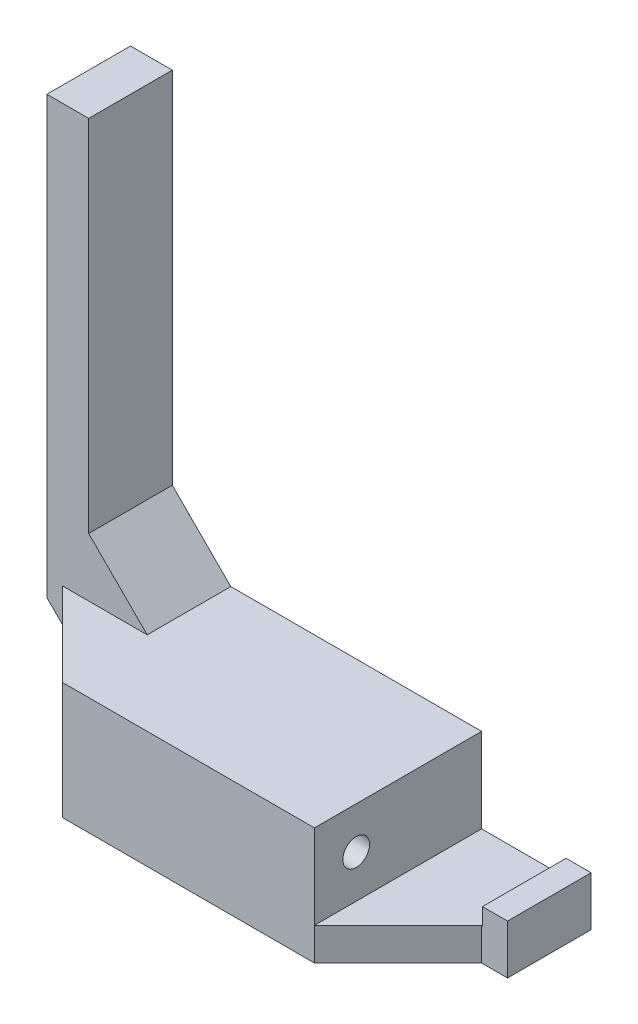
ISO-10303-21;
HEADER;
FILE_DESCRIPTION(('STEP AP214'),'2;1');
FILE_NAME('part.step','',(''),(''),'','','');
FILE_SCHEMA(('AUTOMOTIVE_DESIGN { 1 0 10303 214 1 1 1 1 }'));
ENDSEC;
DATA;
#1=APPLICATION_CONTEXT('core data for automotive mechanical design processes');
#2=APPLICATION_PROTOCOL_DEFINITION('international standard','automotive_design',2000,#1);
#3=PRODUCT_CONTEXT('',#1,'mechanical');
#4=PRODUCT('Part','Part','',(#3));
#5=PRODUCT_RELATED_PRODUCT_CATEGORY('part','',(#4));
#6=PRODUCT_DEFINITION_FORMATION('','',#4);
#7=PRODUCT_DEFINITION_CONTEXT('part definition',#1,'design');
#8=PRODUCT_DEFINITION('design','',#6,#7);
#9=PRODUCT_DEFINITION_SHAPE('','',#8);
#10=(LENGTH_UNIT() NAMED_UNIT(*) SI_UNIT(.MILLI.,.METRE.));
#11=(NAMED_UNIT(*) PLANE_ANGLE_UNIT() SI_UNIT($,.RADIAN.));
#12=(NAMED_UNIT(*) SI_UNIT($,.STERADIAN.) SOLID_ANGLE_UNIT());
#13=UNCERTAINTY_MEASURE_WITH_UNIT(LENGTH_MEASURE(1.E-05),#10,'distance_accuracy_value','');
#14=(GEOMETRIC_REPRESENTATION_CONTEXT(3) GLOBAL_UNCERTAINTY_ASSIGNED_CONTEXT((#13)) GLOBAL_UNIT_ASSIGNED_CONTEXT((#10,
#11,#12)) REPRESENTATION_CONTEXT('',''));
#15=CARTESIAN_POINT('',(0.,0.,0.));
#16=DIRECTION('',(0.,0.,1.));
#17=DIRECTION('',(1.,0.,0.));
#18=AXIS2_PLACEMENT_3D('',#15,#16,#17);
#19=CARTESIAN_POINT('',(-42.,5.1,15.));
#20=DIRECTION('',(1.,0.,0.));
#21=DIRECTION('',(0.,0.,-1.));
#22=AXIS2_PLACEMENT_3D('',#19,#20,#21);
#23=CYLINDRICAL_SURFACE('',#22,1.6);
#24=CARTESIAN_POINT('',(0.,5.1,15.));
#25=DIRECTION('',(1.,0.,0.));
#26=DIRECTION('',(0.,0.,-1.));
#27=AXIS2_PLACEMENT_3D('',#24,#25,#26);
#28=CIRCLE('',#27,1.6);
#29=CARTESIAN_POINT('',(0.,5.1,13.4));
#30=VERTEX_POINT('',#29);
#31=EDGE_CURVE('E181',#30,#30,#28,.T.);
#32=ORIENTED_EDGE('',*,*,#31,.T.);
#33=EDGE_LOOP('',(#32));
#34=FACE_BOUND('',#33,.T.);
#35=CARTESIAN_POINT('',(-19.,5.1,15.));
#36=DIRECTION('',(-1.,0.,0.));
#37=DIRECTION('',(0.,-1.,0.));
#38=AXIS2_PLACEMENT_3D('',#35,#36,#37);
#39=CIRCLE('',#38,1.6);
#40=CARTESIAN_POINT('',(-19.,3.49999999999999,15.));
#41=VERTEX_POINT('',#40);
#42=EDGE_CURVE('E277',#41,#41,#39,.F.);
#43=ORIENTED_EDGE('',*,*,#42,.F.);
#44=EDGE_LOOP('',(#43));
#45=FACE_BOUND('',#44,.T.);
#46=ADVANCED_FACE('F35',(#34,#45),#23,.F.);
#47=CARTESIAN_POINT('',(0.,0.,10.));
#48=DIRECTION('',(0.,0.,-1.));
#49=DIRECTION('',(-1.,0.,0.));
#50=AXIS2_PLACEMENT_3D('',#47,#48,#49);
#51=PLANE('',#50);
#52=DIRECTION('',(-1.,0.,0.));
#53=VECTOR('',#52,1.);
#54=CARTESIAN_POINT('',(10.1,0.,10.));
#55=LINE('',#54,#53);
#56=CARTESIAN_POINT('',(10.1,0.,10.));
#57=VERTEX_POINT('',#56);
#58=CARTESIAN_POINT('',(9.99999999999997,0.,10.));
#59=VERTEX_POINT('',#58);
#60=EDGE_CURVE('E198',#57,#59,#55,.T.);
#61=ORIENTED_EDGE('',*,*,#60,.T.);
#62=DIRECTION('',(0.,-1.,0.));
#63=VECTOR('',#62,1.);
#64=CARTESIAN_POINT('',(9.99999999999997,-3.9,10.));
#65=LINE('',#64,#63);
#66=CARTESIAN_POINT('',(9.99999999999997,-3.9,10.));
#67=VERTEX_POINT('',#66);
#68=EDGE_CURVE('E174',#59,#67,#65,.T.);
#69=ORIENTED_EDGE('',*,*,#68,.T.);
#70=DIRECTION('',(1.,0.,0.));
#71=VECTOR('',#70,1.);
#72=CARTESIAN_POINT('',(-30.142135623731,-3.9,10.));
#73=LINE('',#72,#71);
#74=CARTESIAN_POINT('',(13.1,-3.9,10.));
#75=VERTEX_POINT('',#74);
#76=EDGE_CURVE('E212',#67,#75,#73,.T.);
#77=ORIENTED_EDGE('',*,*,#76,.T.);
#78=DIRECTION('',(0.,1.,0.));
#79=VECTOR('',#78,1.);
#80=CARTESIAN_POINT('',(13.1,-3.9,10.));
#81=LINE('',#80,#79);
#82=CARTESIAN_POINT('',(13.1,2.,10.));
#83=VERTEX_POINT('',#82);
#84=EDGE_CURVE('E214',#75,#83,#81,.T.);
#85=ORIENTED_EDGE('',*,*,#84,.T.);
#86=DIRECTION('',(-1.,0.,0.));
#87=VECTOR('',#86,1.);
#88=CARTESIAN_POINT('',(13.1,2.,10.));
#89=LINE('',#88,#87);
#90=CARTESIAN_POINT('',(10.1,2.,10.));
#91=VERTEX_POINT('',#90);
#92=EDGE_CURVE('E216',#83,#91,#89,.T.);
#93=ORIENTED_EDGE('',*,*,#92,.T.);
#94=DIRECTION('',(0.,-1.,0.));
#95=VECTOR('',#94,1.);
#96=CARTESIAN_POINT('',(10.1,2.,10.));
#97=LINE('',#96,#95);
#98=EDGE_CURVE('E218',#91,#57,#97,.T.);
#99=ORIENTED_EDGE('',*,*,#98,.T.);
#100=EDGE_LOOP('',(#61,#69,#77,#85,#93,#99));
#101=FACE_BOUND('',#100,.T.);
#102=ADVANCED_FACE('F322',(#101),#51,.F.);
#103=DIRECTION('',(0.707106781186547,-0.707106781186549,0.));
#104=VECTOR('',#103,1.);
#105=CARTESIAN_POINT('',(-42.,7.95786437626905,10.));
#106=LINE('',#105,#104);
#107=CARTESIAN_POINT('',(-42.,7.95786437626905,10.));
#108=VERTEX_POINT('',#107);
#109=CARTESIAN_POINT('',(-40.142135623731,6.10000000000009,10.));
#110=VERTEX_POINT('',#109);
#111=EDGE_CURVE('E209',#108,#110,#106,.T.);
#112=ORIENTED_EDGE('',*,*,#111,.T.);
#113=DIRECTION('',(0.,1.,0.));
#114=VECTOR('',#113,1.);
#115=CARTESIAN_POINT('',(-40.142135623731,10.1,10.));
#116=LINE('',#115,#114);
#117=CARTESIAN_POINT('',(-40.142135623731,10.1,10.));
#118=VERTEX_POINT('',#117);
#119=EDGE_CURVE('E197',#110,#118,#116,.T.);
#120=ORIENTED_EDGE('',*,*,#119,.T.);
#121=DIRECTION('',(-1.,0.,0.));
#122=VECTOR('',#121,1.);
#123=CARTESIAN_POINT('',(0.,10.1,10.));
#124=LINE('',#123,#122);
#125=CARTESIAN_POINT('',(-30.,10.1,10.));
#126=VERTEX_POINT('',#125);
#127=EDGE_CURVE('E165',#126,#118,#124,.T.);
#128=ORIENTED_EDGE('',*,*,#127,.F.);
#129=DIRECTION('',(-0.707106781186546,0.707106781186549,0.));
#130=VECTOR('',#129,1.);
#131=CARTESIAN_POINT('',(-30.,10.1,10.));
#132=LINE('',#131,#130);
#133=CARTESIAN_POINT('',(-37.,17.1,10.));
#134=VERTEX_POINT('',#133);
#135=EDGE_CURVE('E200',#126,#134,#132,.T.);
#136=ORIENTED_EDGE('',*,*,#135,.T.);
#137=DIRECTION('',(0.,1.,0.));
#138=VECTOR('',#137,1.);
#139=CARTESIAN_POINT('',(-37.,17.1,10.));
#140=LINE('',#139,#138);
#141=CARTESIAN_POINT('',(-37.,60.1,10.));
#142=VERTEX_POINT('',#141);
#143=EDGE_CURVE('E203',#134,#142,#140,.T.);
#144=ORIENTED_EDGE('',*,*,#143,.T.);
#145=DIRECTION('',(-1.,0.,0.));
#146=VECTOR('',#145,1.);
#147=CARTESIAN_POINT('',(-37.,60.1,10.));
#148=LINE('',#147,#146);
#149=CARTESIAN_POINT('',(-42.,60.1,10.));
#150=VERTEX_POINT('',#149);
#151=EDGE_CURVE('E205',#142,#150,#148,.T.);
#152=ORIENTED_EDGE('',*,*,#151,.T.);
#153=DIRECTION('',(0.,-1.,0.));
#154=VECTOR('',#153,1.);
#155=CARTESIAN_POINT('',(-42.,60.1,10.));
#156=LINE('',#155,#154);
#157=EDGE_CURVE('E207',#150,#108,#156,.T.);
#158=ORIENTED_EDGE('',*,*,#157,.T.);
#159=EDGE_LOOP('',(#112,#120,#128,#136,#144,#152,#158));
#160=FACE_BOUND('',#159,.T.);
#161=ADVANCED_FACE('F299',(#160),#51,.F.);
#162=CARTESIAN_POINT('',(10.1,0.,10.));
#163=DIRECTION('',(0.,-1.,0.));
#164=DIRECTION('',(1.,0.,0.));
#165=AXIS2_PLACEMENT_3D('',#162,#163,#164);
#166=PLANE('',#165);
#167=DIRECTION('',(-1.,0.,0.));
#168=VECTOR('',#167,1.);
#169=CARTESIAN_POINT('',(10.1,0.,0.));
#170=LINE('',#169,#168);
#171=CARTESIAN_POINT('',(10.1,0.,0.));
#172=VERTEX_POINT('',#171);
#173=CARTESIAN_POINT('',(0.,0.,0.));
#174=VERTEX_POINT('',#173);
#175=EDGE_CURVE('E162',#172,#174,#170,.T.);
#176=ORIENTED_EDGE('',*,*,#175,.T.);
#177=DIRECTION('',(0.,0.,-1.));
#178=VECTOR('',#177,1.);
#179=CARTESIAN_POINT('',(0.,0.,10.));
#180=LINE('',#179,#178);
#181=CARTESIAN_POINT('',(0.,0.,20.));
#182=VERTEX_POINT('',#181);
#183=EDGE_CURVE('E158',#182,#174,#180,.T.);
#184=ORIENTED_EDGE('',*,*,#183,.F.);
#185=DIRECTION('',(-0.707106781186543,0.,0.707106781186552));
#186=VECTOR('',#185,1.);
#187=CARTESIAN_POINT('',(10.05,0.,9.94999999999998));
#188=LINE('',#187,#186);
#189=EDGE_CURVE('E58',#182,#59,#188,.F.);
#190=ORIENTED_EDGE('',*,*,#189,.T.);
#191=ORIENTED_EDGE('',*,*,#60,.F.);
#192=DIRECTION('',(0.,0.,-1.));
#193=VECTOR('',#192,1.);
#194=CARTESIAN_POINT('',(10.1,0.,10.));
#195=LINE('',#194,#193);
#196=EDGE_CURVE('E220',#57,#172,#195,.T.);
#197=ORIENTED_EDGE('',*,*,#196,.T.);
#198=EDGE_LOOP('',(#176,#184,#190,#191,#197));
#199=FACE_BOUND('',#198,.T.);
#200=ADVANCED_FACE('F159',(#199),#166,.F.);
#201=CARTESIAN_POINT('',(0.,0.,10.));
#202=DIRECTION('',(-1.,0.,0.));
#203=DIRECTION('',(0.,0.,1.));
#204=AXIS2_PLACEMENT_3D('',#201,#202,#203);
#205=PLANE('',#204);
#206=ORIENTED_EDGE('',*,*,#31,.F.);
#207=EDGE_LOOP('',(#206));
#208=FACE_BOUND('',#207,.T.);
#209=DIRECTION('',(0.,1.,0.));
#210=VECTOR('',#209,1.);
#211=CARTESIAN_POINT('',(0.,10.1,20.));
#212=LINE('',#211,#210);
#213=CARTESIAN_POINT('',(0.,10.1,20.));
#214=VERTEX_POINT('',#213);
#215=EDGE_CURVE('E177',#182,#214,#212,.T.);
#216=ORIENTED_EDGE('',*,*,#215,.F.);
#217=ORIENTED_EDGE('',*,*,#183,.T.);
#218=DIRECTION('',(0.,1.,0.));
#219=VECTOR('',#218,1.);
#220=CARTESIAN_POINT('',(0.,0.,0.));
#221=LINE('',#220,#219);
#222=CARTESIAN_POINT('',(0.,10.1,0.));
#223=VERTEX_POINT('',#222);
#224=EDGE_CURVE('E222',#174,#223,#221,.T.);
#225=ORIENTED_EDGE('',*,*,#224,.T.);
#226=DIRECTION('',(0.,0.,-1.));
#227=VECTOR('',#226,1.);
#228=CARTESIAN_POINT('',(0.,10.1,10.));
#229=LINE('',#228,#227);
#230=EDGE_CURVE('E166',#214,#223,#229,.T.);
#231=ORIENTED_EDGE('',*,*,#230,.F.);
#232=EDGE_LOOP('',(#216,#217,#225,#231));
#233=FACE_BOUND('',#232,.T.);
#234=ADVANCED_FACE('F178',(#208,#233),#205,.F.);
#235=CARTESIAN_POINT('',(0.,10.1,10.));
#236=DIRECTION('',(0.,-1.,0.));
#237=DIRECTION('',(1.,0.,0.));
#238=AXIS2_PLACEMENT_3D('',#235,#236,#237);
#239=PLANE('',#238);
#240=DIRECTION('',(-1.,0.,0.));
#241=VECTOR('',#240,1.);
#242=CARTESIAN_POINT('',(0.,10.1,0.));
#243=LINE('',#242,#241);
#244=CARTESIAN_POINT('',(-30.,10.1,0.));
#245=VERTEX_POINT('',#244);
#246=EDGE_CURVE('E224',#223,#245,#243,.T.);
#247=ORIENTED_EDGE('',*,*,#246,.T.);
#248=DIRECTION('',(0.,0.,-1.));
#249=VECTOR('',#248,1.);
#250=CARTESIAN_POINT('',(-30.,10.1,10.));
#251=LINE('',#250,#249);
#252=EDGE_CURVE('E266',#126,#245,#251,.T.);
#253=ORIENTED_EDGE('',*,*,#252,.F.);
#254=ORIENTED_EDGE('',*,*,#127,.T.);
#255=DIRECTION('',(-0.70710678118655,0.,-0.707106781186545));
#256=VECTOR('',#255,1.);
#257=CARTESIAN_POINT('',(-20.0710678118654,10.1,30.0710678118655));
#258=LINE('',#257,#256);
#259=CARTESIAN_POINT('',(-30.142135623731,10.1,20.));
#260=VERTEX_POINT('',#259);
#261=EDGE_CURVE('E84',#118,#260,#258,.F.);
#262=ORIENTED_EDGE('',*,*,#261,.T.);
#263=DIRECTION('',(-1.,0.,0.));
#264=VECTOR('',#263,1.);
#265=CARTESIAN_POINT('',(0.,10.1,20.));
#266=LINE('',#265,#264);
#267=EDGE_CURVE('E188',#214,#260,#266,.T.);
#268=ORIENTED_EDGE('',*,*,#267,.F.);
#269=ORIENTED_EDGE('',*,*,#230,.T.);
#270=EDGE_LOOP('',(#247,#253,#254,#262,#268,#269));
#271=FACE_BOUND('',#270,.T.);
#272=ADVANCED_FACE('F330',(#271),#239,.F.);
#273=CARTESIAN_POINT('',(-30.,10.1,10.));
#274=DIRECTION('',(-0.707106781186549,-0.707106781186546,0.));
#275=DIRECTION('',(0.707106781186546,-0.707106781186549,0.));
#276=AXIS2_PLACEMENT_3D('',#273,#274,#275);
#277=PLANE('',#276);
#278=DIRECTION('',(-0.707106781186546,0.707106781186549,0.));
#279=VECTOR('',#278,1.);
#280=CARTESIAN_POINT('',(-30.,10.1,0.));
#281=LINE('',#280,#279);
#282=CARTESIAN_POINT('',(-37.,17.1,0.));
#283=VERTEX_POINT('',#282);
#284=EDGE_CURVE('E226',#245,#283,#281,.T.);
#285=ORIENTED_EDGE('',*,*,#284,.T.);
#286=DIRECTION('',(0.,0.,-1.));
#287=VECTOR('',#286,1.);
#288=CARTESIAN_POINT('',(-37.,17.1,10.));
#289=LINE('',#288,#287);
#290=EDGE_CURVE('E263',#134,#283,#289,.T.);
#291=ORIENTED_EDGE('',*,*,#290,.F.);
#292=ORIENTED_EDGE('',*,*,#135,.F.);
#293=ORIENTED_EDGE('',*,*,#252,.T.);
#294=EDGE_LOOP('',(#285,#291,#292,#293));
#295=FACE_BOUND('',#294,.T.);
#296=ADVANCED_FACE('F333',(#295),#277,.F.);
#297=CARTESIAN_POINT('',(-37.,17.1,10.));
#298=DIRECTION('',(-1.,0.,0.));
#299=DIRECTION('',(0.,0.,1.));
#300=AXIS2_PLACEMENT_3D('',#297,#298,#299);
#301=PLANE('',#300);
#302=DIRECTION('',(0.,1.,0.));
#303=VECTOR('',#302,1.);
#304=CARTESIAN_POINT('',(-37.,17.1,0.));
#305=LINE('',#304,#303);
#306=CARTESIAN_POINT('',(-37.,60.1,0.));
#307=VERTEX_POINT('',#306);
#308=EDGE_CURVE('E228',#283,#307,#305,.T.);
#309=ORIENTED_EDGE('',*,*,#308,.T.);
#310=DIRECTION('',(0.,0.,-1.));
#311=VECTOR('',#310,1.);
#312=CARTESIAN_POINT('',(-37.,60.1,10.));
#313=LINE('',#312,#311);
#314=EDGE_CURVE('E260',#142,#307,#313,.T.);
#315=ORIENTED_EDGE('',*,*,#314,.F.);
#316=ORIENTED_EDGE('',*,*,#143,.F.);
#317=ORIENTED_EDGE('',*,*,#290,.T.);
#318=EDGE_LOOP('',(#309,#315,#316,#317));
#319=FACE_BOUND('',#318,.T.);
#320=ADVANCED_FACE('F338',(#319),#301,.F.);
#321=CARTESIAN_POINT('',(-37.,60.1,10.));
#322=DIRECTION('',(0.,-1.,0.));
#323=DIRECTION('',(0.,0.,-1.));
#324=AXIS2_PLACEMENT_3D('',#321,#322,#323);
#325=PLANE('',#324);
#326=DIRECTION('',(-1.,0.,0.));
#327=VECTOR('',#326,1.);
#328=CARTESIAN_POINT('',(-37.,60.1,0.));
#329=LINE('',#328,#327);
#330=CARTESIAN_POINT('',(-42.,60.1,0.));
#331=VERTEX_POINT('',#330);
#332=EDGE_CURVE('E230',#307,#331,#329,.T.);
#333=ORIENTED_EDGE('',*,*,#332,.T.);
#334=DIRECTION('',(0.,0.,-1.));
#335=VECTOR('',#334,1.);
#336=CARTESIAN_POINT('',(-42.,60.1,10.));
#337=LINE('',#336,#335);
#338=EDGE_CURVE('E257',#150,#331,#337,.T.);
#339=ORIENTED_EDGE('',*,*,#338,.F.);
#340=ORIENTED_EDGE('',*,*,#151,.F.);
#341=ORIENTED_EDGE('',*,*,#314,.T.);
#342=EDGE_LOOP('',(#333,#339,#340,#341));
#343=FACE_BOUND('',#342,.T.);
#344=ADVANCED_FACE('F342',(#343),#325,.F.);
#345=CARTESIAN_POINT('',(-42.,60.1,10.));
#346=DIRECTION('',(1.,0.,0.));
#347=DIRECTION('',(0.,1.,0.));
#348=AXIS2_PLACEMENT_3D('',#345,#346,#347);
#349=PLANE('',#348);
#350=DIRECTION('',(0.,-1.,0.));
#351=VECTOR('',#350,1.);
#352=CARTESIAN_POINT('',(-42.,60.1,0.));
#353=LINE('',#352,#351);
#354=CARTESIAN_POINT('',(-42.,7.95786437626905,0.));
#355=VERTEX_POINT('',#354);
#356=EDGE_CURVE('E232',#331,#355,#353,.T.);
#357=ORIENTED_EDGE('',*,*,#356,.T.);
#358=DIRECTION('',(0.,0.,-1.));
#359=VECTOR('',#358,1.);
#360=CARTESIAN_POINT('',(-42.,7.95786437626905,10.));
#361=LINE('',#360,#359);
#362=EDGE_CURVE('E254',#108,#355,#361,.T.);
#363=ORIENTED_EDGE('',*,*,#362,.F.);
#364=ORIENTED_EDGE('',*,*,#157,.F.);
#365=ORIENTED_EDGE('',*,*,#338,.T.);
#366=EDGE_LOOP('',(#357,#363,#364,#365));
#367=FACE_BOUND('',#366,.T.);
#368=ADVANCED_FACE('F344',(#367),#349,.F.);
#369=CARTESIAN_POINT('',(-42.,7.95786437626905,10.));
#370=DIRECTION('',(0.707106781186548,0.707106781186547,0.));
#371=DIRECTION('',(-0.707106781186547,0.707106781186548,0.));
#372=AXIS2_PLACEMENT_3D('',#369,#370,#371);
#373=PLANE('',#372);
#374=DIRECTION('',(0.577350269189627,-0.577350269189628,0.577350269189623));
#375=VECTOR('',#374,1.);
#376=CARTESIAN_POINT('',(-41.380711874577,7.33857625084607,8.76142374915404));
#377=LINE('',#376,#375);
#378=CARTESIAN_POINT('',(-30.142135623731,-3.9,20.));
#379=VERTEX_POINT('',#378);
#380=CARTESIAN_POINT('',(-36.4350288425443,2.39289321881339,13.7071067811867));
#381=VERTEX_POINT('',#380);
#382=EDGE_CURVE('E274',#379,#381,#377,.F.);
#383=ORIENTED_EDGE('',*,*,#382,.T.);
#384=CARTESIAN_POINT('',(-39.142135623731,5.1,15.));
#385=DIRECTION('',(0.707106781186548,0.707106781186547,0.));
#386=DIRECTION('',(-0.707106781186547,0.707106781186548,0.));
#387=AXIS2_PLACEMENT_3D('',#384,#385,#386);
#388=ELLIPSE('',#387,4.24264068711928,3.);
#389=CARTESIAN_POINT('',(-37.8492424049176,3.80710678118668,12.2928932188134));
#390=VERTEX_POINT('',#389);
#391=EDGE_CURVE('E50',#381,#390,#388,.T.);
#392=ORIENTED_EDGE('',*,*,#391,.T.);
#393=EDGE_CURVE('E273',#390,#110,#377,.F.);
#394=ORIENTED_EDGE('',*,*,#393,.T.);
#395=ORIENTED_EDGE('',*,*,#111,.F.);
#396=ORIENTED_EDGE('',*,*,#362,.T.);
#397=DIRECTION('',(0.707106781186547,-0.707106781186549,0.));
#398=VECTOR('',#397,1.);
#399=CARTESIAN_POINT('',(-42.,7.95786437626905,0.));
#400=LINE('',#399,#398);
#401=CARTESIAN_POINT('',(-30.142135623731,-3.9,0.));
#402=VERTEX_POINT('',#401);
#403=EDGE_CURVE('E234',#355,#402,#400,.T.);
#404=ORIENTED_EDGE('',*,*,#403,.T.);
#405=DIRECTION('',(0.,0.,-1.));
#406=VECTOR('',#405,1.);
#407=CARTESIAN_POINT('',(-30.142135623731,-3.9,10.));
#408=LINE('',#407,#406);
#409=EDGE_CURVE('E72',#379,#402,#408,.T.);
#410=ORIENTED_EDGE('',*,*,#409,.F.);
#411=EDGE_LOOP('',(#383,#392,#394,#395,#396,#404,#410));
#412=FACE_BOUND('',#411,.T.);
#413=ADVANCED_FACE('F293',(#412),#373,.F.);
#414=CARTESIAN_POINT('',(-30.142135623731,-3.9,10.));
#415=DIRECTION('',(0.,1.,0.));
#416=DIRECTION('',(-1.,0.,0.));
#417=AXIS2_PLACEMENT_3D('',#414,#415,#416);
#418=PLANE('',#417);
#419=DIRECTION('',(1.,0.,0.));
#420=VECTOR('',#419,1.);
#421=CARTESIAN_POINT('',(-30.142135623731,-3.9,0.));
#422=LINE('',#421,#420);
#423=CARTESIAN_POINT('',(13.1,-3.9,0.));
#424=VERTEX_POINT('',#423);
#425=EDGE_CURVE('E236',#402,#424,#422,.T.);
#426=ORIENTED_EDGE('',*,*,#425,.T.);
#427=DIRECTION('',(0.,0.,-1.));
#428=VECTOR('',#427,1.);
#429=CARTESIAN_POINT('',(13.1,-3.9,10.));
#430=LINE('',#429,#428);
#431=EDGE_CURVE('E250',#75,#424,#430,.T.);
#432=ORIENTED_EDGE('',*,*,#431,.F.);
#433=ORIENTED_EDGE('',*,*,#76,.F.);
#434=DIRECTION('',(0.707106781186543,0.,-0.707106781186552));
#435=VECTOR('',#434,1.);
#436=CARTESIAN_POINT('',(-10.0710678118653,-3.9,30.0710678118655));
#437=LINE('',#436,#435);
#438=CARTESIAN_POINT('',(0.,-3.9,20.));
#439=VERTEX_POINT('',#438);
#440=EDGE_CURVE('E44',#67,#439,#437,.F.);
#441=ORIENTED_EDGE('',*,*,#440,.T.);
#442=DIRECTION('',(1.,0.,0.));
#443=VECTOR('',#442,1.);
#444=CARTESIAN_POINT('',(0.,-3.9,20.));
#445=LINE('',#444,#443);
#446=EDGE_CURVE('E187',#379,#439,#445,.T.);
#447=ORIENTED_EDGE('',*,*,#446,.F.);
#448=ORIENTED_EDGE('',*,*,#409,.T.);
#449=EDGE_LOOP('',(#426,#432,#433,#441,#447,#448));
#450=FACE_BOUND('',#449,.T.);
#451=ADVANCED_FACE('F314',(#450),#418,.F.);
#452=CARTESIAN_POINT('',(13.1,-3.9,10.));
#453=DIRECTION('',(-1.,0.,0.));
#454=DIRECTION('',(0.,0.,1.));
#455=AXIS2_PLACEMENT_3D('',#452,#453,#454);
#456=PLANE('',#455);
#457=DIRECTION('',(0.,1.,0.));
#458=VECTOR('',#457,1.);
#459=CARTESIAN_POINT('',(13.1,-3.9,0.));
#460=LINE('',#459,#458);
#461=CARTESIAN_POINT('',(13.1,2.,0.));
#462=VERTEX_POINT('',#461);
#463=EDGE_CURVE('E238',#424,#462,#460,.T.);
#464=ORIENTED_EDGE('',*,*,#463,.T.);
#465=DIRECTION('',(0.,0.,-1.));
#466=VECTOR('',#465,1.);
#467=CARTESIAN_POINT('',(13.1,2.,10.));
#468=LINE('',#467,#466);
#469=EDGE_CURVE('E247',#83,#462,#468,.T.);
#470=ORIENTED_EDGE('',*,*,#469,.F.);
#471=ORIENTED_EDGE('',*,*,#84,.F.);
#472=ORIENTED_EDGE('',*,*,#431,.T.);
#473=EDGE_LOOP('',(#464,#470,#471,#472));
#474=FACE_BOUND('',#473,.T.);
#475=ADVANCED_FACE('F318',(#474),#456,.F.);
#476=CARTESIAN_POINT('',(13.1,2.,10.));
#477=DIRECTION('',(0.,-1.,0.));
#478=DIRECTION('',(0.,0.,-1.));
#479=AXIS2_PLACEMENT_3D('',#476,#477,#478);
#480=PLANE('',#479);
#481=DIRECTION('',(-1.,0.,0.));
#482=VECTOR('',#481,1.);
#483=CARTESIAN_POINT('',(13.1,2.,0.));
#484=LINE('',#483,#482);
#485=CARTESIAN_POINT('',(10.1,2.,0.));
#486=VERTEX_POINT('',#485);
#487=EDGE_CURVE('E240',#462,#486,#484,.T.);
#488=ORIENTED_EDGE('',*,*,#487,.T.);
#489=DIRECTION('',(0.,0.,-1.));
#490=VECTOR('',#489,1.);
#491=CARTESIAN_POINT('',(10.1,2.,10.));
#492=LINE('',#491,#490);
#493=EDGE_CURVE('E244',#91,#486,#492,.T.);
#494=ORIENTED_EDGE('',*,*,#493,.F.);
#495=ORIENTED_EDGE('',*,*,#92,.F.);
#496=ORIENTED_EDGE('',*,*,#469,.T.);
#497=EDGE_LOOP('',(#488,#494,#495,#496));
#498=FACE_BOUND('',#497,.T.);
#499=ADVANCED_FACE('F371',(#498),#480,.F.);
#500=CARTESIAN_POINT('',(10.1,2.,10.));
#501=DIRECTION('',(1.,0.,0.));
#502=DIRECTION('',(0.,0.,-1.));
#503=AXIS2_PLACEMENT_3D('',#500,#501,#502);
#504=PLANE('',#503);
#505=DIRECTION('',(0.,-1.,0.));
#506=VECTOR('',#505,1.);
#507=CARTESIAN_POINT('',(10.1,2.,0.));
#508=LINE('',#507,#506);
#509=EDGE_CURVE('E201',#486,#172,#508,.T.);
#510=ORIENTED_EDGE('',*,*,#509,.T.);
#511=ORIENTED_EDGE('',*,*,#196,.F.);
#512=ORIENTED_EDGE('',*,*,#98,.F.);
#513=ORIENTED_EDGE('',*,*,#493,.T.);
#514=EDGE_LOOP('',(#510,#511,#512,#513));
#515=FACE_BOUND('',#514,.T.);
#516=ADVANCED_FACE('F368',(#515),#504,.F.);
#517=CARTESIAN_POINT('',(0.,0.,0.));
#518=DIRECTION('',(0.,0.,-1.));
#519=DIRECTION('',(-1.,0.,0.));
#520=AXIS2_PLACEMENT_3D('',#517,#518,#519);
#521=PLANE('',#520);
#522=ORIENTED_EDGE('',*,*,#175,.F.);
#523=ORIENTED_EDGE('',*,*,#509,.F.);
#524=ORIENTED_EDGE('',*,*,#487,.F.);
#525=ORIENTED_EDGE('',*,*,#463,.F.);
#526=ORIENTED_EDGE('',*,*,#425,.F.);
#527=ORIENTED_EDGE('',*,*,#403,.F.);
#528=ORIENTED_EDGE('',*,*,#356,.F.);
#529=ORIENTED_EDGE('',*,*,#332,.F.);
#530=ORIENTED_EDGE('',*,*,#308,.F.);
#531=ORIENTED_EDGE('',*,*,#284,.F.);
#532=ORIENTED_EDGE('',*,*,#246,.F.);
#533=ORIENTED_EDGE('',*,*,#224,.F.);
#534=EDGE_LOOP('',(#522,#523,#524,#525,#526,#527,#528,#529,#530,#531,#532,#533));
#535=FACE_BOUND('',#534,.T.);
#536=ADVANCED_FACE('F308',(#535),#521,.T.);
#537=CARTESIAN_POINT('',(0.,0.,20.));
#538=DIRECTION('',(0.,0.,-1.));
#539=DIRECTION('',(-1.,0.,0.));
#540=AXIS2_PLACEMENT_3D('',#537,#538,#539);
#541=PLANE('',#540);
#542=EDGE_CURVE('E173',#439,#182,#212,.T.);
#543=ORIENTED_EDGE('',*,*,#542,.T.);
#544=ORIENTED_EDGE('',*,*,#215,.T.);
#545=ORIENTED_EDGE('',*,*,#267,.T.);
#546=DIRECTION('',(0.,-1.,0.));
#547=VECTOR('',#546,1.);
#548=CARTESIAN_POINT('',(-30.142135623731,10.1,20.));
#549=LINE('',#548,#547);
#550=EDGE_CURVE('E189',#260,#379,#549,.T.);
#551=ORIENTED_EDGE('',*,*,#550,.T.);
#552=ORIENTED_EDGE('',*,*,#446,.T.);
#553=EDGE_LOOP('',(#543,#544,#545,#551,#552));
#554=FACE_BOUND('',#553,.T.);
#555=ADVANCED_FACE('F184',(#554),#541,.F.);
#556=CARTESIAN_POINT('',(-30.142135623731,10.1,20.));
#557=DIRECTION('',(-0.707106781186545,0.,0.70710678118655));
#558=DIRECTION('',(0.,1.,0.));
#559=AXIS2_PLACEMENT_3D('',#556,#557,#558);
#560=PLANE('',#559);
#561=ORIENTED_EDGE('',*,*,#393,.F.);
#562=CARTESIAN_POINT('',(-35.142135623731,5.1,15.));
#563=DIRECTION('',(-0.707106781186545,0.,0.70710678118655));
#564=DIRECTION('',(-0.70710678118655,0.,-0.707106781186545));
#565=AXIS2_PLACEMENT_3D('',#562,#563,#564);
#566=ELLIPSE('',#565,4.2426406871193,3.);
#567=EDGE_CURVE('E11',#390,#381,#566,.F.);
#568=ORIENTED_EDGE('',*,*,#567,.T.);
#569=ORIENTED_EDGE('',*,*,#382,.F.);
#570=ORIENTED_EDGE('',*,*,#550,.F.);
#571=ORIENTED_EDGE('',*,*,#261,.F.);
#572=ORIENTED_EDGE('',*,*,#119,.F.);
#573=EDGE_LOOP('',(#561,#568,#569,#570,#571,#572));
#574=FACE_BOUND('',#573,.T.);
#575=ADVANCED_FACE('F296',(#574),#560,.T.);
#576=CARTESIAN_POINT('',(0.,0.,20.0000000000001));
#577=DIRECTION('',(0.707106781186552,0.,0.707106781186543));
#578=DIRECTION('',(0.,-1.,0.));
#579=AXIS2_PLACEMENT_3D('',#576,#577,#578);
#580=PLANE('',#579);
#581=ORIENTED_EDGE('',*,*,#440,.F.);
#582=ORIENTED_EDGE('',*,*,#68,.F.);
#583=ORIENTED_EDGE('',*,*,#189,.F.);
#584=ORIENTED_EDGE('',*,*,#542,.F.);
#585=EDGE_LOOP('',(#581,#582,#583,#584));
#586=FACE_BOUND('',#585,.T.);
#587=ADVANCED_FACE('F38',(#586),#580,.T.);
#588=CARTESIAN_POINT('',(-19.,5.1,15.));
#589=DIRECTION('',(-1.,0.,0.));
#590=DIRECTION('',(0.,-1.,0.));
#591=AXIS2_PLACEMENT_3D('',#588,#589,#590);
#592=CYLINDRICAL_SURFACE('',#591,3.);
#593=CARTESIAN_POINT('',(-19.,5.1,15.));
#594=DIRECTION('',(-1.,0.,0.));
#595=DIRECTION('',(0.,-1.,0.));
#596=AXIS2_PLACEMENT_3D('',#593,#594,#595);
#597=CIRCLE('',#596,3.);
#598=CARTESIAN_POINT('',(-19.,2.1,15.));
#599=VERTEX_POINT('',#598);
#600=EDGE_CURVE('E279',#599,#599,#597,.T.);
#601=ORIENTED_EDGE('',*,*,#600,.F.);
#602=EDGE_LOOP('',(#601));
#603=FACE_BOUND('',#602,.T.);
#604=ORIENTED_EDGE('',*,*,#567,.F.);
#605=ORIENTED_EDGE('',*,*,#391,.F.);
#606=EDGE_LOOP('',(#604,#605));
#607=FACE_BOUND('',#606,.T.);
#608=ADVANCED_FACE('F288',(#603,#607),#592,.F.);
#609=CARTESIAN_POINT('',(-19.,5.1,15.));
#610=DIRECTION('',(-1.,0.,0.));
#611=DIRECTION('',(0.,-1.,0.));
#612=AXIS2_PLACEMENT_3D('',#609,#610,#611);
#613=PLANE('',#612);
#614=ORIENTED_EDGE('',*,*,#600,.T.);
#615=EDGE_LOOP('',(#614));
#616=FACE_BOUND('',#615,.T.);
#617=ORIENTED_EDGE('',*,*,#42,.T.);
#618=EDGE_LOOP('',(#617));
#619=FACE_BOUND('',#618,.T.);
#620=ADVANCED_FACE('F286',(#616,#619),#613,.T.);
#621=CLOSED_SHELL('',(#46,#102,#161,#200,#234,#272,#296,#320,#344,#368,#413,#451,#475,#499,#516,
#536,#555,#575,#587,#608,#620));
#622=MANIFOLD_SOLID_BREP('B2',#621);
#623=ADVANCED_BREP_SHAPE_REPRESENTATION('',(#18,#622),#14);
#624=SHAPE_DEFINITION_REPRESENTATION(#9,#623);
ENDSEC;
END-ISO-10303-21;
